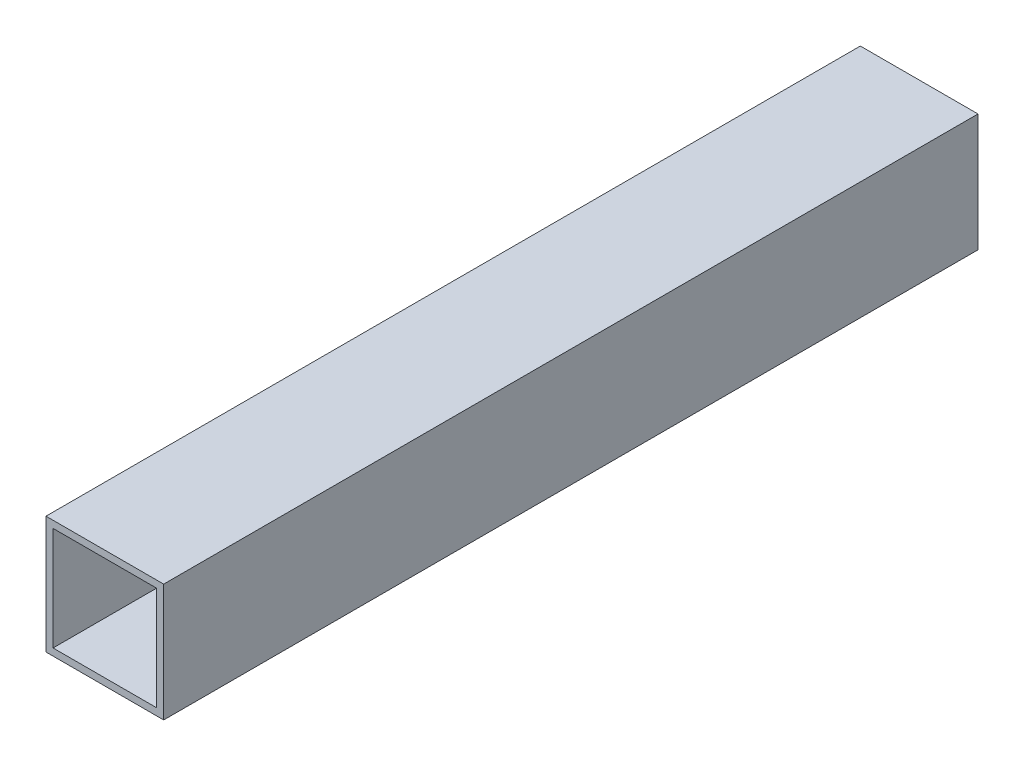
ISO-10303-21;
HEADER;
FILE_DESCRIPTION(('STEP AP214'),'2;1');
FILE_NAME('part.step','',(''),(''),'','','');
FILE_SCHEMA(('AUTOMOTIVE_DESIGN { 1 0 10303 214 1 1 1 1 }'));
ENDSEC;
DATA;
#1=APPLICATION_CONTEXT('core data for automotive mechanical design processes');
#2=APPLICATION_PROTOCOL_DEFINITION('international standard','automotive_design',2000,#1);
#3=PRODUCT_CONTEXT('',#1,'mechanical');
#4=PRODUCT('Part','Part','',(#3));
#5=PRODUCT_RELATED_PRODUCT_CATEGORY('part','',(#4));
#6=PRODUCT_DEFINITION_FORMATION('','',#4);
#7=PRODUCT_DEFINITION_CONTEXT('part definition',#1,'design');
#8=PRODUCT_DEFINITION('design','',#6,#7);
#9=PRODUCT_DEFINITION_SHAPE('','',#8);
#10=(LENGTH_UNIT() NAMED_UNIT(*) SI_UNIT(.MILLI.,.METRE.));
#11=(NAMED_UNIT(*) PLANE_ANGLE_UNIT() SI_UNIT($,.RADIAN.));
#12=(NAMED_UNIT(*) SI_UNIT($,.STERADIAN.) SOLID_ANGLE_UNIT());
#13=UNCERTAINTY_MEASURE_WITH_UNIT(LENGTH_MEASURE(1.E-05),#10,'distance_accuracy_value','');
#14=(GEOMETRIC_REPRESENTATION_CONTEXT(3) GLOBAL_UNCERTAINTY_ASSIGNED_CONTEXT((#13)) GLOBAL_UNIT_ASSIGNED_CONTEXT((#10,
#11,#12)) REPRESENTATION_CONTEXT('',''));
#15=CARTESIAN_POINT('',(0.,0.,0.));
#16=DIRECTION('',(0.,0.,1.));
#17=DIRECTION('',(1.,0.,0.));
#18=AXIS2_PLACEMENT_3D('',#15,#16,#17);
#19=CARTESIAN_POINT('',(0.,0.,173.));
#20=DIRECTION('',(0.,0.,1.));
#21=DIRECTION('',(1.,0.,0.));
#22=AXIS2_PLACEMENT_3D('',#19,#20,#21);
#23=PLANE('',#22);
#24=DIRECTION('',(0.,1.,0.));
#25=VECTOR('',#24,1.);
#26=CARTESIAN_POINT('',(12.5,-12.5,173.));
#27=LINE('',#26,#25);
#28=CARTESIAN_POINT('',(12.5,-12.5,173.));
#29=VERTEX_POINT('',#28);
#30=CARTESIAN_POINT('',(12.5,12.5,173.));
#31=VERTEX_POINT('',#30);
#32=EDGE_CURVE('E177',#29,#31,#27,.T.);
#33=ORIENTED_EDGE('',*,*,#32,.T.);
#34=DIRECTION('',(-1.,0.,0.));
#35=VECTOR('',#34,1.);
#36=CARTESIAN_POINT('',(-12.5,12.5,173.));
#37=LINE('',#36,#35);
#38=CARTESIAN_POINT('',(-12.5,12.5,173.));
#39=VERTEX_POINT('',#38);
#40=EDGE_CURVE('E181',#31,#39,#37,.T.);
#41=ORIENTED_EDGE('',*,*,#40,.T.);
#42=DIRECTION('',(0.,-1.,0.));
#43=VECTOR('',#42,1.);
#44=CARTESIAN_POINT('',(-12.5,-12.5,173.));
#45=LINE('',#44,#43);
#46=CARTESIAN_POINT('',(-12.5,-12.5,173.));
#47=VERTEX_POINT('',#46);
#48=EDGE_CURVE('E185',#39,#47,#45,.T.);
#49=ORIENTED_EDGE('',*,*,#48,.T.);
#50=DIRECTION('',(1.,0.,0.));
#51=VECTOR('',#50,1.);
#52=CARTESIAN_POINT('',(-12.5,-12.5,173.));
#53=LINE('',#52,#51);
#54=EDGE_CURVE('E188',#47,#29,#53,.T.);
#55=ORIENTED_EDGE('',*,*,#54,.T.);
#56=EDGE_LOOP('',(#33,#41,#49,#55));
#57=FACE_BOUND('',#56,.T.);
#58=DIRECTION('',(-1.,0.,0.));
#59=VECTOR('',#58,1.);
#60=CARTESIAN_POINT('',(0.,11.,173.));
#61=LINE('',#60,#59);
#62=CARTESIAN_POINT('',(11.,11.,173.));
#63=VERTEX_POINT('',#62);
#64=CARTESIAN_POINT('',(-11.,11.,173.));
#65=VERTEX_POINT('',#64);
#66=EDGE_CURVE('E137',#63,#65,#61,.T.);
#67=ORIENTED_EDGE('',*,*,#66,.F.);
#68=DIRECTION('',(0.,1.,0.));
#69=VECTOR('',#68,1.);
#70=CARTESIAN_POINT('',(11.,0.,173.));
#71=LINE('',#70,#69);
#72=CARTESIAN_POINT('',(11.,-11.,173.));
#73=VERTEX_POINT('',#72);
#74=EDGE_CURVE('E128',#73,#63,#71,.T.);
#75=ORIENTED_EDGE('',*,*,#74,.F.);
#76=DIRECTION('',(1.,0.,0.));
#77=VECTOR('',#76,1.);
#78=CARTESIAN_POINT('',(0.,-11.,173.));
#79=LINE('',#78,#77);
#80=CARTESIAN_POINT('',(-11.,-11.,173.));
#81=VERTEX_POINT('',#80);
#82=EDGE_CURVE('E155',#81,#73,#79,.T.);
#83=ORIENTED_EDGE('',*,*,#82,.F.);
#84=DIRECTION('',(0.,-1.,0.));
#85=VECTOR('',#84,1.);
#86=CARTESIAN_POINT('',(-11.,0.,173.));
#87=LINE('',#86,#85);
#88=EDGE_CURVE('E150',#65,#81,#87,.T.);
#89=ORIENTED_EDGE('',*,*,#88,.F.);
#90=EDGE_LOOP('',(#67,#75,#83,#89));
#91=FACE_BOUND('',#90,.T.);
#92=ADVANCED_FACE('F62',(#57,#91),#23,.T.);
#93=CARTESIAN_POINT('',(0.,0.,0.));
#94=DIRECTION('',(0.,0.,1.));
#95=DIRECTION('',(1.,0.,0.));
#96=AXIS2_PLACEMENT_3D('',#93,#94,#95);
#97=PLANE('',#96);
#98=DIRECTION('',(0.,1.,0.));
#99=VECTOR('',#98,1.);
#100=CARTESIAN_POINT('',(12.5,-12.5,0.));
#101=LINE('',#100,#99);
#102=CARTESIAN_POINT('',(12.5,-12.5,0.));
#103=VERTEX_POINT('',#102);
#104=CARTESIAN_POINT('',(12.5,12.5,0.));
#105=VERTEX_POINT('',#104);
#106=EDGE_CURVE('E146',#103,#105,#101,.T.);
#107=ORIENTED_EDGE('',*,*,#106,.F.);
#108=DIRECTION('',(1.,0.,0.));
#109=VECTOR('',#108,1.);
#110=CARTESIAN_POINT('',(-12.5,-12.5,0.));
#111=LINE('',#110,#109);
#112=CARTESIAN_POINT('',(-12.5,-12.5,0.));
#113=VERTEX_POINT('',#112);
#114=EDGE_CURVE('E182',#113,#103,#111,.T.);
#115=ORIENTED_EDGE('',*,*,#114,.F.);
#116=DIRECTION('',(0.,-1.,0.));
#117=VECTOR('',#116,1.);
#118=CARTESIAN_POINT('',(-12.5,-12.5,0.));
#119=LINE('',#118,#117);
#120=CARTESIAN_POINT('',(-12.5,12.5,0.));
#121=VERTEX_POINT('',#120);
#122=EDGE_CURVE('E198',#121,#113,#119,.T.);
#123=ORIENTED_EDGE('',*,*,#122,.F.);
#124=DIRECTION('',(-1.,0.,0.));
#125=VECTOR('',#124,1.);
#126=CARTESIAN_POINT('',(-12.5,12.5,0.));
#127=LINE('',#126,#125);
#128=EDGE_CURVE('E195',#105,#121,#127,.T.);
#129=ORIENTED_EDGE('',*,*,#128,.F.);
#130=EDGE_LOOP('',(#107,#115,#123,#129));
#131=FACE_BOUND('',#130,.T.);
#132=DIRECTION('',(0.,1.,0.));
#133=VECTOR('',#132,1.);
#134=CARTESIAN_POINT('',(11.,0.,0.));
#135=LINE('',#134,#133);
#136=CARTESIAN_POINT('',(11.,-11.,0.));
#137=VERTEX_POINT('',#136);
#138=CARTESIAN_POINT('',(11.,11.,0.));
#139=VERTEX_POINT('',#138);
#140=EDGE_CURVE('E86',#137,#139,#135,.T.);
#141=ORIENTED_EDGE('',*,*,#140,.T.);
#142=DIRECTION('',(-1.,0.,0.));
#143=VECTOR('',#142,1.);
#144=CARTESIAN_POINT('',(0.,11.,0.));
#145=LINE('',#144,#143);
#146=CARTESIAN_POINT('',(-11.,11.,0.));
#147=VERTEX_POINT('',#146);
#148=EDGE_CURVE('E144',#139,#147,#145,.T.);
#149=ORIENTED_EDGE('',*,*,#148,.T.);
#150=DIRECTION('',(0.,-1.,0.));
#151=VECTOR('',#150,1.);
#152=CARTESIAN_POINT('',(-11.,0.,0.));
#153=LINE('',#152,#151);
#154=CARTESIAN_POINT('',(-11.,-11.,0.));
#155=VERTEX_POINT('',#154);
#156=EDGE_CURVE('E164',#147,#155,#153,.T.);
#157=ORIENTED_EDGE('',*,*,#156,.T.);
#158=DIRECTION('',(1.,0.,0.));
#159=VECTOR('',#158,1.);
#160=CARTESIAN_POINT('',(0.,-11.,0.));
#161=LINE('',#160,#159);
#162=EDGE_CURVE('E138',#155,#137,#161,.T.);
#163=ORIENTED_EDGE('',*,*,#162,.T.);
#164=EDGE_LOOP('',(#141,#149,#157,#163));
#165=FACE_BOUND('',#164,.T.);
#166=ADVANCED_FACE('F222',(#131,#165),#97,.F.);
#167=CARTESIAN_POINT('',(12.5,-12.5,173.));
#168=DIRECTION('',(-1.,0.,0.));
#169=DIRECTION('',(0.,0.,1.));
#170=AXIS2_PLACEMENT_3D('',#167,#168,#169);
#171=PLANE('',#170);
#172=ORIENTED_EDGE('',*,*,#106,.T.);
#173=DIRECTION('',(0.,0.,-1.));
#174=VECTOR('',#173,1.);
#175=CARTESIAN_POINT('',(12.5,12.5,173.));
#176=LINE('',#175,#174);
#177=EDGE_CURVE('E12',#31,#105,#176,.T.);
#178=ORIENTED_EDGE('',*,*,#177,.F.);
#179=ORIENTED_EDGE('',*,*,#32,.F.);
#180=DIRECTION('',(0.,0.,-1.));
#181=VECTOR('',#180,1.);
#182=CARTESIAN_POINT('',(12.5,-12.5,173.));
#183=LINE('',#182,#181);
#184=EDGE_CURVE('E191',#29,#103,#183,.T.);
#185=ORIENTED_EDGE('',*,*,#184,.T.);
#186=EDGE_LOOP('',(#172,#178,#179,#185));
#187=FACE_BOUND('',#186,.T.);
#188=ADVANCED_FACE('F64',(#187),#171,.F.);
#189=CARTESIAN_POINT('',(-12.5,12.5,173.));
#190=DIRECTION('',(0.,-1.,0.));
#191=DIRECTION('',(0.,0.,-1.));
#192=AXIS2_PLACEMENT_3D('',#189,#190,#191);
#193=PLANE('',#192);
#194=ORIENTED_EDGE('',*,*,#128,.T.);
#195=DIRECTION('',(0.,0.,-1.));
#196=VECTOR('',#195,1.);
#197=CARTESIAN_POINT('',(-12.5,12.5,173.));
#198=LINE('',#197,#196);
#199=EDGE_CURVE('E71',#39,#121,#198,.T.);
#200=ORIENTED_EDGE('',*,*,#199,.F.);
#201=ORIENTED_EDGE('',*,*,#40,.F.);
#202=ORIENTED_EDGE('',*,*,#177,.T.);
#203=EDGE_LOOP('',(#194,#200,#201,#202));
#204=FACE_BOUND('',#203,.T.);
#205=ADVANCED_FACE('F232',(#204),#193,.F.);
#206=CARTESIAN_POINT('',(-12.5,-12.5,173.));
#207=DIRECTION('',(1.,0.,0.));
#208=DIRECTION('',(0.,0.,-1.));
#209=AXIS2_PLACEMENT_3D('',#206,#207,#208);
#210=PLANE('',#209);
#211=ORIENTED_EDGE('',*,*,#122,.T.);
#212=DIRECTION('',(0.,0.,-1.));
#213=VECTOR('',#212,1.);
#214=CARTESIAN_POINT('',(-12.5,-12.5,173.));
#215=LINE('',#214,#213);
#216=EDGE_CURVE('E206',#47,#113,#215,.T.);
#217=ORIENTED_EDGE('',*,*,#216,.F.);
#218=ORIENTED_EDGE('',*,*,#48,.F.);
#219=ORIENTED_EDGE('',*,*,#199,.T.);
#220=EDGE_LOOP('',(#211,#217,#218,#219));
#221=FACE_BOUND('',#220,.T.);
#222=ADVANCED_FACE('F216',(#221),#210,.F.);
#223=CARTESIAN_POINT('',(-12.5,-12.5,173.));
#224=DIRECTION('',(0.,1.,0.));
#225=DIRECTION('',(0.,0.,1.));
#226=AXIS2_PLACEMENT_3D('',#223,#224,#225);
#227=PLANE('',#226);
#228=ORIENTED_EDGE('',*,*,#114,.T.);
#229=ORIENTED_EDGE('',*,*,#184,.F.);
#230=ORIENTED_EDGE('',*,*,#54,.F.);
#231=ORIENTED_EDGE('',*,*,#216,.T.);
#232=EDGE_LOOP('',(#228,#229,#230,#231));
#233=FACE_BOUND('',#232,.T.);
#234=ADVANCED_FACE('F226',(#233),#227,.F.);
#235=CARTESIAN_POINT('',(11.,0.,173.));
#236=DIRECTION('',(-1.,0.,0.));
#237=DIRECTION('',(0.,0.,1.));
#238=AXIS2_PLACEMENT_3D('',#235,#236,#237);
#239=PLANE('',#238);
#240=ORIENTED_EDGE('',*,*,#140,.F.);
#241=DIRECTION('',(0.,0.,-1.));
#242=VECTOR('',#241,1.);
#243=CARTESIAN_POINT('',(11.,-11.,173.));
#244=LINE('',#243,#242);
#245=EDGE_CURVE('E132',#73,#137,#244,.T.);
#246=ORIENTED_EDGE('',*,*,#245,.F.);
#247=ORIENTED_EDGE('',*,*,#74,.T.);
#248=DIRECTION('',(0.,0.,-1.));
#249=VECTOR('',#248,1.);
#250=CARTESIAN_POINT('',(11.,11.,173.));
#251=LINE('',#250,#249);
#252=EDGE_CURVE('E131',#63,#139,#251,.T.);
#253=ORIENTED_EDGE('',*,*,#252,.T.);
#254=EDGE_LOOP('',(#240,#246,#247,#253));
#255=FACE_BOUND('',#254,.T.);
#256=ADVANCED_FACE('F130',(#255),#239,.T.);
#257=CARTESIAN_POINT('',(0.,11.,173.));
#258=DIRECTION('',(0.,-1.,0.));
#259=DIRECTION('',(0.,0.,-1.));
#260=AXIS2_PLACEMENT_3D('',#257,#258,#259);
#261=PLANE('',#260);
#262=ORIENTED_EDGE('',*,*,#148,.F.);
#263=ORIENTED_EDGE('',*,*,#252,.F.);
#264=ORIENTED_EDGE('',*,*,#66,.T.);
#265=DIRECTION('',(0.,0.,-1.));
#266=VECTOR('',#265,1.);
#267=CARTESIAN_POINT('',(-11.,11.,173.));
#268=LINE('',#267,#266);
#269=EDGE_CURVE('E147',#65,#147,#268,.T.);
#270=ORIENTED_EDGE('',*,*,#269,.T.);
#271=EDGE_LOOP('',(#262,#263,#264,#270));
#272=FACE_BOUND('',#271,.T.);
#273=ADVANCED_FACE('F141',(#272),#261,.T.);
#274=CARTESIAN_POINT('',(-11.,0.,173.));
#275=DIRECTION('',(1.,0.,0.));
#276=DIRECTION('',(0.,0.,-1.));
#277=AXIS2_PLACEMENT_3D('',#274,#275,#276);
#278=PLANE('',#277);
#279=ORIENTED_EDGE('',*,*,#156,.F.);
#280=ORIENTED_EDGE('',*,*,#269,.F.);
#281=ORIENTED_EDGE('',*,*,#88,.T.);
#282=DIRECTION('',(0.,0.,-1.));
#283=VECTOR('',#282,1.);
#284=CARTESIAN_POINT('',(-11.,-11.,173.));
#285=LINE('',#284,#283);
#286=EDGE_CURVE('E78',#81,#155,#285,.T.);
#287=ORIENTED_EDGE('',*,*,#286,.T.);
#288=EDGE_LOOP('',(#279,#280,#281,#287));
#289=FACE_BOUND('',#288,.T.);
#290=ADVANCED_FACE('F255',(#289),#278,.T.);
#291=CARTESIAN_POINT('',(0.,-11.,173.));
#292=DIRECTION('',(0.,1.,0.));
#293=DIRECTION('',(0.,0.,1.));
#294=AXIS2_PLACEMENT_3D('',#291,#292,#293);
#295=PLANE('',#294);
#296=ORIENTED_EDGE('',*,*,#162,.F.);
#297=ORIENTED_EDGE('',*,*,#286,.F.);
#298=ORIENTED_EDGE('',*,*,#82,.T.);
#299=ORIENTED_EDGE('',*,*,#245,.T.);
#300=EDGE_LOOP('',(#296,#297,#298,#299));
#301=FACE_BOUND('',#300,.T.);
#302=ADVANCED_FACE('F259',(#301),#295,.T.);
#303=CLOSED_SHELL('',(#92,#166,#188,#205,#222,#234,#256,#273,#290,#302));
#304=MANIFOLD_SOLID_BREP('B2',#303);
#305=ADVANCED_BREP_SHAPE_REPRESENTATION('',(#18,#304),#14);
#306=SHAPE_DEFINITION_REPRESENTATION(#9,#305);
ENDSEC;
END-ISO-10303-21;
